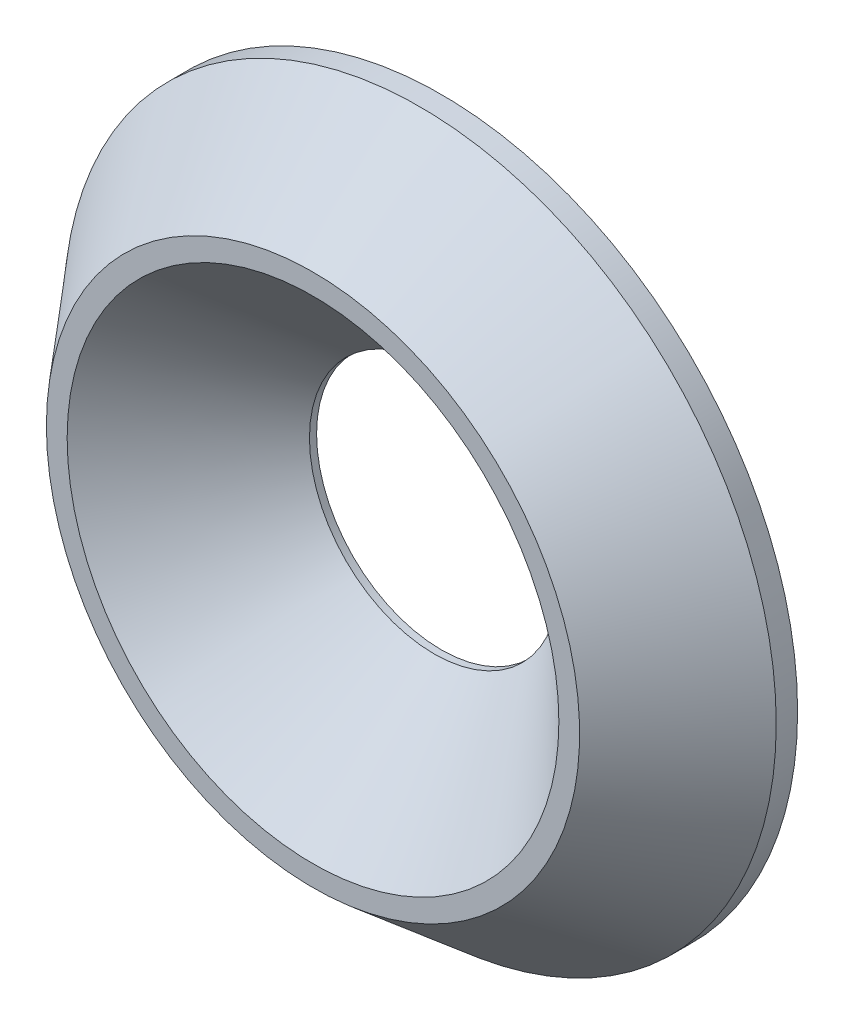
ISO-10303-21;
HEADER;
FILE_DESCRIPTION(('STEP AP214'),'2;1');
FILE_NAME('part.step','',(''),(''),'','','');
FILE_SCHEMA(('AUTOMOTIVE_DESIGN { 1 0 10303 214 1 1 1 1 }'));
ENDSEC;
DATA;
#1=APPLICATION_CONTEXT('core data for automotive mechanical design processes');
#2=APPLICATION_PROTOCOL_DEFINITION('international standard','automotive_design',2000,#1);
#3=PRODUCT_CONTEXT('',#1,'mechanical');
#4=PRODUCT('Part','Part','',(#3));
#5=PRODUCT_RELATED_PRODUCT_CATEGORY('part','',(#4));
#6=PRODUCT_DEFINITION_FORMATION('','',#4);
#7=PRODUCT_DEFINITION_CONTEXT('part definition',#1,'design');
#8=PRODUCT_DEFINITION('design','',#6,#7);
#9=PRODUCT_DEFINITION_SHAPE('','',#8);
#10=(LENGTH_UNIT() NAMED_UNIT(*) SI_UNIT(.MILLI.,.METRE.));
#11=(NAMED_UNIT(*) PLANE_ANGLE_UNIT() SI_UNIT($,.RADIAN.));
#12=(NAMED_UNIT(*) SI_UNIT($,.STERADIAN.) SOLID_ANGLE_UNIT());
#13=UNCERTAINTY_MEASURE_WITH_UNIT(LENGTH_MEASURE(1.E-05),#10,'distance_accuracy_value','');
#14=(GEOMETRIC_REPRESENTATION_CONTEXT(3) GLOBAL_UNCERTAINTY_ASSIGNED_CONTEXT((#13)) GLOBAL_UNIT_ASSIGNED_CONTEXT((#10,
#11,#12)) REPRESENTATION_CONTEXT('',''));
#15=CARTESIAN_POINT('',(0.,0.,0.));
#16=DIRECTION('',(0.,0.,1.));
#17=DIRECTION('',(1.,0.,0.));
#18=AXIS2_PLACEMENT_3D('',#15,#16,#17);
#19=CARTESIAN_POINT('',(0.,0.,1.8));
#20=DIRECTION('',(0.,0.,1.));
#21=DIRECTION('',(1.,0.,0.));
#22=AXIS2_PLACEMENT_3D('',#19,#20,#21);
#23=PLANE('',#22);
#24=CARTESIAN_POINT('',(0.,0.,1.80000000000291));
#25=DIRECTION('',(0.,0.,1.));
#26=DIRECTION('',(1.,0.,0.));
#27=AXIS2_PLACEMENT_3D('',#24,#25,#26);
#28=CIRCLE('',#27,3.45000000015716);
#29=CARTESIAN_POINT('',(3.45000000015716,0.,1.80000000000291));
#30=VERTEX_POINT('',#29);
#31=EDGE_CURVE('E31',#30,#30,#28,.F.);
#32=ORIENTED_EDGE('',*,*,#31,.T.);
#33=EDGE_LOOP('',(#32));
#34=FACE_BOUND('',#33,.T.);
#35=CARTESIAN_POINT('',(0.,0.,1.80000000000291));
#36=DIRECTION('',(0.,0.,-1.));
#37=DIRECTION('',(-1.,0.,0.));
#38=AXIS2_PLACEMENT_3D('',#35,#36,#37);
#39=CIRCLE('',#38,3.74135055324132);
#40=CARTESIAN_POINT('',(-3.74135055324132,0.,1.80000000000291));
#41=VERTEX_POINT('',#40);
#42=EDGE_CURVE('E17',#41,#41,#39,.T.);
#43=ORIENTED_EDGE('',*,*,#42,.F.);
#44=EDGE_LOOP('',(#43));
#45=FACE_BOUND('',#44,.T.);
#46=ADVANCED_FACE('F14',(#34,#45),#23,.T.);
#47=CARTESIAN_POINT('',(0.,0.,0.300000000038381));
#48=DIRECTION('',(0.,0.,-1.));
#49=DIRECTION('',(-1.,0.,0.));
#50=AXIS2_PLACEMENT_3D('',#47,#48,#49);
#51=CONICAL_SURFACE('',#50,4.99999999999545,0.698131700804765);
#52=ORIENTED_EDGE('',*,*,#42,.T.);
#53=EDGE_LOOP('',(#52));
#54=FACE_BOUND('',#53,.T.);
#55=CARTESIAN_POINT('',(0.,0.,0.299999999999994));
#56=DIRECTION('',(0.,0.,-1.));
#57=DIRECTION('',(-1.,0.,0.));
#58=AXIS2_PLACEMENT_3D('',#55,#56,#57);
#59=CIRCLE('',#58,5.);
#60=CARTESIAN_POINT('',(-5.,0.,0.299999999999994));
#61=VERTEX_POINT('',#60);
#62=EDGE_CURVE('E29',#61,#61,#59,.T.);
#63=ORIENTED_EDGE('',*,*,#62,.F.);
#64=EDGE_LOOP('',(#63));
#65=FACE_BOUND('',#64,.T.);
#66=ADVANCED_FACE('F39',(#54,#65),#51,.T.);
#67=CARTESIAN_POINT('',(0.,0.,1.79999999988922));
#68=DIRECTION('',(0.,0.,1.));
#69=DIRECTION('',(1.,0.,0.));
#70=AXIS2_PLACEMENT_3D('',#67,#68,#69);
#71=CONICAL_SURFACE('',#70,3.45000000004347,0.785398163397448);
#72=ORIENTED_EDGE('',*,*,#31,.F.);
#73=EDGE_LOOP('',(#72));
#74=FACE_BOUND('',#73,.T.);
#75=CARTESIAN_POINT('',(0.,0.,0.100000000000004));
#76=DIRECTION('',(0.,0.,-1.));
#77=DIRECTION('',(-1.,0.,0.));
#78=AXIS2_PLACEMENT_3D('',#75,#76,#77);
#79=CIRCLE('',#78,1.75);
#80=CARTESIAN_POINT('',(-1.75,0.,0.100000000000004));
#81=VERTEX_POINT('',#80);
#82=EDGE_CURVE('E26',#81,#81,#79,.T.);
#83=ORIENTED_EDGE('',*,*,#82,.T.);
#84=EDGE_LOOP('',(#83));
#85=FACE_BOUND('',#84,.T.);
#86=ADVANCED_FACE('F47',(#74,#85),#71,.F.);
#87=CARTESIAN_POINT('',(0.,0.,1.8));
#88=DIRECTION('',(0.,0.,-1.));
#89=DIRECTION('',(-1.,0.,0.));
#90=AXIS2_PLACEMENT_3D('',#87,#88,#89);
#91=CYLINDRICAL_SURFACE('',#90,5.);
#92=ORIENTED_EDGE('',*,*,#62,.T.);
#93=EDGE_LOOP('',(#92));
#94=FACE_BOUND('',#93,.T.);
#95=CARTESIAN_POINT('',(0.,0.,0.));
#96=DIRECTION('',(0.,0.,-1.));
#97=DIRECTION('',(-1.,0.,0.));
#98=AXIS2_PLACEMENT_3D('',#95,#96,#97);
#99=CIRCLE('',#98,5.);
#100=CARTESIAN_POINT('',(-5.,0.,0.));
#101=VERTEX_POINT('',#100);
#102=EDGE_CURVE('E21',#101,#101,#99,.F.);
#103=ORIENTED_EDGE('',*,*,#102,.T.);
#104=EDGE_LOOP('',(#103));
#105=FACE_BOUND('',#104,.T.);
#106=ADVANCED_FACE('F56',(#94,#105),#91,.T.);
#107=CARTESIAN_POINT('',(0.,0.,1.8));
#108=DIRECTION('',(0.,0.,-1.));
#109=DIRECTION('',(-1.,0.,0.));
#110=AXIS2_PLACEMENT_3D('',#107,#108,#109);
#111=CYLINDRICAL_SURFACE('',#110,1.75);
#112=CARTESIAN_POINT('',(0.,0.,0.));
#113=DIRECTION('',(0.,0.,-1.));
#114=DIRECTION('',(-1.,0.,0.));
#115=AXIS2_PLACEMENT_3D('',#112,#113,#114);
#116=CIRCLE('',#115,1.75);
#117=CARTESIAN_POINT('',(-1.75,0.,0.));
#118=VERTEX_POINT('',#117);
#119=EDGE_CURVE('E10',#118,#118,#116,.T.);
#120=ORIENTED_EDGE('',*,*,#119,.T.);
#121=EDGE_LOOP('',(#120));
#122=FACE_BOUND('',#121,.T.);
#123=ORIENTED_EDGE('',*,*,#82,.F.);
#124=EDGE_LOOP('',(#123));
#125=FACE_BOUND('',#124,.T.);
#126=ADVANCED_FACE('F50',(#122,#125),#111,.F.);
#127=CARTESIAN_POINT('',(0.,0.,0.));
#128=DIRECTION('',(0.,0.,1.));
#129=DIRECTION('',(1.,0.,0.));
#130=AXIS2_PLACEMENT_3D('',#127,#128,#129);
#131=PLANE('',#130);
#132=ORIENTED_EDGE('',*,*,#119,.F.);
#133=EDGE_LOOP('',(#132));
#134=FACE_BOUND('',#133,.T.);
#135=ORIENTED_EDGE('',*,*,#102,.F.);
#136=EDGE_LOOP('',(#135));
#137=FACE_BOUND('',#136,.T.);
#138=ADVANCED_FACE('F48',(#134,#137),#131,.F.);
#139=CLOSED_SHELL('',(#46,#66,#86,#106,#126,#138));
#140=MANIFOLD_SOLID_BREP('B1',#139);
#141=ADVANCED_BREP_SHAPE_REPRESENTATION('',(#18,#140),#14);
#142=SHAPE_DEFINITION_REPRESENTATION(#9,#141);
ENDSEC;
END-ISO-10303-21;
